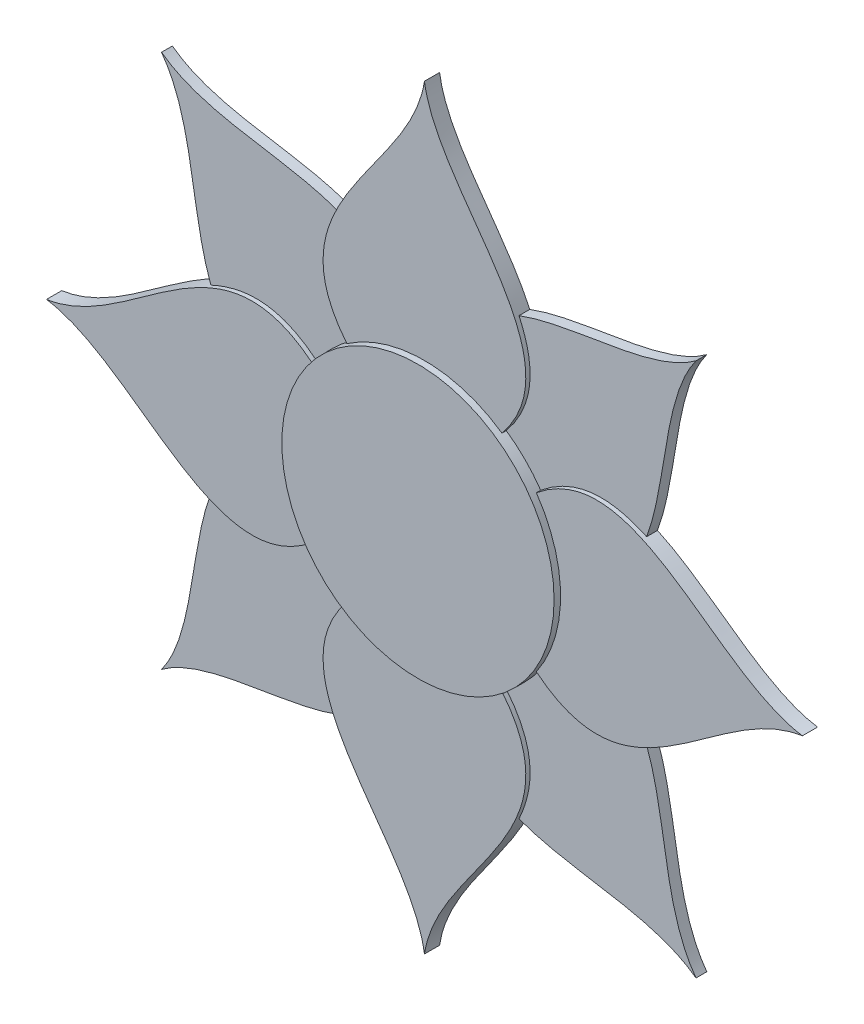
ISO-10303-21;
HEADER;
FILE_DESCRIPTION(('STEP AP214'),'2;1');
FILE_NAME('part.step','',(''),(''),'','','');
FILE_SCHEMA(('AUTOMOTIVE_DESIGN { 1 0 10303 214 1 1 1 1 }'));
ENDSEC;
DATA;
#1=APPLICATION_CONTEXT('core data for automotive mechanical design processes');
#2=APPLICATION_PROTOCOL_DEFINITION('international standard','automotive_design',2000,#1);
#3=PRODUCT_CONTEXT('',#1,'mechanical');
#4=PRODUCT('Part','Part','',(#3));
#5=PRODUCT_RELATED_PRODUCT_CATEGORY('part','',(#4));
#6=PRODUCT_DEFINITION_FORMATION('','',#4);
#7=PRODUCT_DEFINITION_CONTEXT('part definition',#1,'design');
#8=PRODUCT_DEFINITION('design','',#6,#7);
#9=PRODUCT_DEFINITION_SHAPE('','',#8);
#10=(LENGTH_UNIT() NAMED_UNIT(*) SI_UNIT(.MILLI.,.METRE.));
#11=(NAMED_UNIT(*) PLANE_ANGLE_UNIT() SI_UNIT($,.RADIAN.));
#12=(NAMED_UNIT(*) SI_UNIT($,.STERADIAN.) SOLID_ANGLE_UNIT());
#13=UNCERTAINTY_MEASURE_WITH_UNIT(LENGTH_MEASURE(1.E-05),#10,'distance_accuracy_value','');
#14=(GEOMETRIC_REPRESENTATION_CONTEXT(3) GLOBAL_UNCERTAINTY_ASSIGNED_CONTEXT((#13)) GLOBAL_UNIT_ASSIGNED_CONTEXT((#10,
#11,#12)) REPRESENTATION_CONTEXT('',''));
#15=CARTESIAN_POINT('',(0.,0.,0.));
#16=DIRECTION('',(0.,0.,1.));
#17=DIRECTION('',(1.,0.,0.));
#18=AXIS2_PLACEMENT_3D('',#15,#16,#17);
#19=CARTESIAN_POINT('',(-51.7912492608534,-35.8726678931079,7.));
#20=CARTESIAN_POINT('',(-96.7225206489418,-72.6487430730365,7.));
#21=CARTESIAN_POINT('',(-133.625302995382,-6.16642341126356,7.));
#22=CARTESIAN_POINT('',(-174.887829116811,1.83185277525639E-12,7.));
#23=B_SPLINE_CURVE_WITH_KNOTS('',3,(#19,#20,#21,#22),.UNSPECIFIED.,.F.,.F.,(4,4),(0.,1.),.UNSPECIFIED.);
#24=DIRECTION('',(0.,0.,-1.));
#25=VECTOR('',#24,1.);
#26=SURFACE_OF_LINEAR_EXTRUSION('',#23,#25);
#27=CARTESIAN_POINT('',(-51.7912492608534,-35.8726678931079,0.));
#28=CARTESIAN_POINT('',(-96.7225206489418,-72.6487430730365,0.));
#29=CARTESIAN_POINT('',(-133.625302995382,-6.16642341126356,0.));
#30=CARTESIAN_POINT('',(-174.887829116811,1.83185277525639E-12,0.));
#31=B_SPLINE_CURVE_WITH_KNOTS('',3,(#27,#28,#29,#30),.UNSPECIFIED.,.F.,.F.,(4,4),(0.,1.),.UNSPECIFIED.);
#32=CARTESIAN_POINT('',(-100.829128315532,-41.7647924305539,0.));
#33=VERTEX_POINT('',#32);
#34=CARTESIAN_POINT('',(-174.887829116811,1.83185277525639E-12,0.));
#35=VERTEX_POINT('',#34);
#36=EDGE_CURVE('E487',#33,#35,#31,.T.);
#37=ORIENTED_EDGE('',*,*,#36,.F.);
#38=DIRECTION('',(0.,0.,-1.));
#39=VECTOR('',#38,1.);
#40=CARTESIAN_POINT('',(-100.829128315532,-41.7647924305539,5.));
#41=LINE('',#40,#39);
#42=CARTESIAN_POINT('',(-100.829128315532,-41.7647924305539,5.));
#43=VERTEX_POINT('',#42);
#44=EDGE_CURVE('E90',#43,#33,#41,.T.);
#45=ORIENTED_EDGE('',*,*,#44,.F.);
#46=CARTESIAN_POINT('',(-51.7912492608534,-35.8726678931079,5.));
#47=CARTESIAN_POINT('',(-96.7225206489418,-72.6487430730365,5.));
#48=CARTESIAN_POINT('',(-133.625302995382,-6.16642341126356,5.));
#49=CARTESIAN_POINT('',(-174.887829116811,1.83185277525639E-12,5.));
#50=B_SPLINE_CURVE_WITH_KNOTS('',3,(#46,#47,#48,#49),.UNSPECIFIED.,.F.,.F.,(4,4),(0.,1.),.UNSPECIFIED.);
#51=CARTESIAN_POINT('',(-51.7912492608534,-35.8726678931079,5.));
#52=VERTEX_POINT('',#51);
#53=EDGE_CURVE('E94',#52,#43,#50,.T.);
#54=ORIENTED_EDGE('',*,*,#53,.F.);
#55=DIRECTION('',(0.,0.,-1.));
#56=VECTOR('',#55,1.);
#57=CARTESIAN_POINT('',(-51.7912492608534,-35.8726678931079,7.));
#58=LINE('',#57,#56);
#59=CARTESIAN_POINT('',(-51.7912492608534,-35.8726678931079,7.));
#60=VERTEX_POINT('',#59);
#61=EDGE_CURVE('E82',#60,#52,#58,.T.);
#62=ORIENTED_EDGE('',*,*,#61,.F.);
#63=CARTESIAN_POINT('',(-174.887829116811,1.83185277525639E-12,7.));
#64=VERTEX_POINT('',#63);
#65=EDGE_CURVE('E524',#60,#64,#23,.T.);
#66=ORIENTED_EDGE('',*,*,#65,.T.);
#67=DIRECTION('',(0.,0.,-1.));
#68=VECTOR('',#67,1.);
#69=CARTESIAN_POINT('',(-174.887829116811,1.83185277525639E-12,7.));
#70=LINE('',#69,#68);
#71=EDGE_CURVE('E470',#64,#35,#70,.T.);
#72=ORIENTED_EDGE('',*,*,#71,.T.);
#73=EDGE_LOOP('',(#37,#45,#54,#62,#66,#72));
#74=FACE_BOUND('',#73,.T.);
#75=ADVANCED_FACE('F71',(#74),#26,.T.);
#76=CARTESIAN_POINT('',(35.8726678931081,-51.7912492608532,7.));
#77=CARTESIAN_POINT('',(72.6487430730368,-96.7225206489416,7.));
#78=CARTESIAN_POINT('',(6.16642341126404,-133.625302995382,7.));
#79=CARTESIAN_POINT('',(-1.22123518350426E-12,-174.887829116811,7.));
#80=B_SPLINE_CURVE_WITH_KNOTS('',3,(#76,#77,#78,#79),.UNSPECIFIED.,.F.,.F.,(4,4),(0.,1.),.UNSPECIFIED.);
#81=DIRECTION('',(0.,0.,-1.));
#82=VECTOR('',#81,1.);
#83=SURFACE_OF_LINEAR_EXTRUSION('',#80,#82);
#84=CARTESIAN_POINT('',(35.8726678931081,-51.7912492608532,0.));
#85=CARTESIAN_POINT('',(72.6487430730368,-96.7225206489416,0.));
#86=CARTESIAN_POINT('',(6.16642341126404,-133.625302995382,0.));
#87=CARTESIAN_POINT('',(-1.22123518350426E-12,-174.887829116811,0.));
#88=B_SPLINE_CURVE_WITH_KNOTS('',3,(#84,#85,#86,#87),.UNSPECIFIED.,.F.,.F.,(4,4),(0.,1.),.UNSPECIFIED.);
#89=CARTESIAN_POINT('',(41.7647924305543,-100.829128315532,0.));
#90=VERTEX_POINT('',#89);
#91=CARTESIAN_POINT('',(-1.22123518350426E-12,-174.887829116811,0.));
#92=VERTEX_POINT('',#91);
#93=EDGE_CURVE('E582',#90,#92,#88,.T.);
#94=ORIENTED_EDGE('',*,*,#93,.F.);
#95=DIRECTION('',(0.,0.,-1.));
#96=VECTOR('',#95,1.);
#97=CARTESIAN_POINT('',(41.7647924305543,-100.829128315532,5.));
#98=LINE('',#97,#96);
#99=CARTESIAN_POINT('',(41.7647924305543,-100.829128315532,5.));
#100=VERTEX_POINT('',#99);
#101=EDGE_CURVE('E302',#100,#90,#98,.T.);
#102=ORIENTED_EDGE('',*,*,#101,.F.);
#103=CARTESIAN_POINT('',(35.8726678931081,-51.7912492608532,5.));
#104=CARTESIAN_POINT('',(72.6487430730368,-96.7225206489416,5.));
#105=CARTESIAN_POINT('',(6.16642341126404,-133.625302995382,5.));
#106=CARTESIAN_POINT('',(-1.22123518350426E-12,-174.887829116811,5.));
#107=B_SPLINE_CURVE_WITH_KNOTS('',3,(#103,#104,#105,#106),.UNSPECIFIED.,.F.,.F.,(4,4),(0.,1.),.UNSPECIFIED.);
#108=CARTESIAN_POINT('',(35.8726678931081,-51.7912492608532,5.));
#109=VERTEX_POINT('',#108);
#110=EDGE_CURVE('E616',#109,#100,#107,.T.);
#111=ORIENTED_EDGE('',*,*,#110,.F.);
#112=DIRECTION('',(0.,0.,-1.));
#113=VECTOR('',#112,1.);
#114=CARTESIAN_POINT('',(35.8726678931081,-51.7912492608532,7.));
#115=LINE('',#114,#113);
#116=CARTESIAN_POINT('',(35.8726678931081,-51.7912492608532,7.));
#117=VERTEX_POINT('',#116);
#118=EDGE_CURVE('E413',#117,#109,#115,.T.);
#119=ORIENTED_EDGE('',*,*,#118,.F.);
#120=CARTESIAN_POINT('',(-1.22123518350426E-12,-174.887829116811,7.));
#121=VERTEX_POINT('',#120);
#122=EDGE_CURVE('E353',#117,#121,#80,.T.);
#123=ORIENTED_EDGE('',*,*,#122,.T.);
#124=DIRECTION('',(0.,0.,-1.));
#125=VECTOR('',#124,1.);
#126=CARTESIAN_POINT('',(-1.22123518350426E-12,-174.887829116811,7.));
#127=LINE('',#126,#125);
#128=EDGE_CURVE('E607',#121,#92,#127,.T.);
#129=ORIENTED_EDGE('',*,*,#128,.T.);
#130=EDGE_LOOP('',(#94,#102,#111,#119,#123,#129));
#131=FACE_BOUND('',#130,.T.);
#132=ADVANCED_FACE('F366',(#131),#83,.T.);
#133=CARTESIAN_POINT('',(51.7912492608531,35.8726678931083,7.));
#134=CARTESIAN_POINT('',(96.7225206489414,72.6487430730372,7.));
#135=CARTESIAN_POINT('',(133.625302995382,6.16642341126452,7.));
#136=CARTESIAN_POINT('',(174.887829116811,-6.10617591752131E-13,7.));
#137=B_SPLINE_CURVE_WITH_KNOTS('',3,(#133,#134,#135,#136),.UNSPECIFIED.,.F.,.F.,(4,4),(0.,1.),.UNSPECIFIED.);
#138=DIRECTION('',(0.,0.,-1.));
#139=VECTOR('',#138,1.);
#140=SURFACE_OF_LINEAR_EXTRUSION('',#137,#139);
#141=CARTESIAN_POINT('',(51.7912492608531,35.8726678931083,0.));
#142=CARTESIAN_POINT('',(96.7225206489414,72.6487430730372,0.));
#143=CARTESIAN_POINT('',(133.625302995382,6.16642341126452,0.));
#144=CARTESIAN_POINT('',(174.887829116811,-6.10617591752131E-13,0.));
#145=B_SPLINE_CURVE_WITH_KNOTS('',3,(#141,#142,#143,#144),.UNSPECIFIED.,.F.,.F.,(4,4),(0.,1.),.UNSPECIFIED.);
#146=CARTESIAN_POINT('',(100.829128315532,41.7647924305546,0.));
#147=VERTEX_POINT('',#146);
#148=CARTESIAN_POINT('',(174.887829116811,-6.10617591752131E-13,0.));
#149=VERTEX_POINT('',#148);
#150=EDGE_CURVE('E408',#147,#149,#145,.T.);
#151=ORIENTED_EDGE('',*,*,#150,.F.);
#152=DIRECTION('',(0.,0.,-1.));
#153=VECTOR('',#152,1.);
#154=CARTESIAN_POINT('',(100.829128315532,41.7647924305546,5.));
#155=LINE('',#154,#153);
#156=CARTESIAN_POINT('',(100.829128315532,41.7647924305546,5.));
#157=VERTEX_POINT('',#156);
#158=EDGE_CURVE('E538',#157,#147,#155,.T.);
#159=ORIENTED_EDGE('',*,*,#158,.F.);
#160=CARTESIAN_POINT('',(51.7912492608531,35.8726678931083,5.));
#161=CARTESIAN_POINT('',(96.7225206489414,72.6487430730372,5.));
#162=CARTESIAN_POINT('',(133.625302995382,6.16642341126452,5.));
#163=CARTESIAN_POINT('',(174.887829116811,-6.10617591752131E-13,5.));
#164=B_SPLINE_CURVE_WITH_KNOTS('',3,(#160,#161,#162,#163),.UNSPECIFIED.,.F.,.F.,(4,4),(0.,1.),.UNSPECIFIED.);
#165=CARTESIAN_POINT('',(51.7912492608531,35.8726678931083,5.));
#166=VERTEX_POINT('',#165);
#167=EDGE_CURVE('E310',#166,#157,#164,.T.);
#168=ORIENTED_EDGE('',*,*,#167,.F.);
#169=DIRECTION('',(0.,0.,-1.));
#170=VECTOR('',#169,1.);
#171=CARTESIAN_POINT('',(51.7912492608531,35.8726678931083,7.));
#172=LINE('',#171,#170);
#173=CARTESIAN_POINT('',(51.7912492608531,35.8726678931083,7.));
#174=VERTEX_POINT('',#173);
#175=EDGE_CURVE('E418',#174,#166,#172,.T.);
#176=ORIENTED_EDGE('',*,*,#175,.F.);
#177=CARTESIAN_POINT('',(174.887829116811,-6.10617591752131E-13,7.));
#178=VERTEX_POINT('',#177);
#179=EDGE_CURVE('E664',#174,#178,#137,.T.);
#180=ORIENTED_EDGE('',*,*,#179,.T.);
#181=DIRECTION('',(0.,0.,-1.));
#182=VECTOR('',#181,1.);
#183=CARTESIAN_POINT('',(174.887829116811,-6.10617591752131E-13,7.));
#184=LINE('',#183,#182);
#185=EDGE_CURVE('E391',#178,#149,#184,.T.);
#186=ORIENTED_EDGE('',*,*,#185,.T.);
#187=EDGE_LOOP('',(#151,#159,#168,#176,#180,#186));
#188=FACE_BOUND('',#187,.T.);
#189=ADVANCED_FACE('F370',(#188),#140,.T.);
#190=CARTESIAN_POINT('',(-35.8726678931085,51.791249260853,7.));
#191=CARTESIAN_POINT('',(-72.6487430730375,96.7225206489411,7.));
#192=CARTESIAN_POINT('',(-6.16642341126502,133.625302995382,7.));
#193=CARTESIAN_POINT('',(0.,174.887829116811,7.));
#194=B_SPLINE_CURVE_WITH_KNOTS('',3,(#190,#191,#192,#193),.UNSPECIFIED.,.F.,.F.,(4,4),(0.,1.),.UNSPECIFIED.);
#195=DIRECTION('',(0.,0.,-1.));
#196=VECTOR('',#195,1.);
#197=SURFACE_OF_LINEAR_EXTRUSION('',#194,#196);
#198=CARTESIAN_POINT('',(-35.8726678931085,51.791249260853,0.));
#199=CARTESIAN_POINT('',(-72.6487430730375,96.7225206489411,0.));
#200=CARTESIAN_POINT('',(-6.16642341126502,133.625302995382,0.));
#201=CARTESIAN_POINT('',(0.,174.887829116811,0.));
#202=B_SPLINE_CURVE_WITH_KNOTS('',3,(#198,#199,#200,#201),.UNSPECIFIED.,.F.,.F.,(4,4),(0.,1.),.UNSPECIFIED.);
#203=CARTESIAN_POINT('',(-41.7647924305546,100.829128315533,0.));
#204=VERTEX_POINT('',#203);
#205=CARTESIAN_POINT('',(0.,174.887829116811,0.));
#206=VERTEX_POINT('',#205);
#207=EDGE_CURVE('E433',#204,#206,#202,.T.);
#208=ORIENTED_EDGE('',*,*,#207,.F.);
#209=DIRECTION('',(0.,0.,-1.));
#210=VECTOR('',#209,1.);
#211=CARTESIAN_POINT('',(-41.7647924305546,100.829128315533,5.));
#212=LINE('',#211,#210);
#213=CARTESIAN_POINT('',(-41.7647924305546,100.829128315533,5.));
#214=VERTEX_POINT('',#213);
#215=EDGE_CURVE('E352',#214,#204,#212,.T.);
#216=ORIENTED_EDGE('',*,*,#215,.F.);
#217=CARTESIAN_POINT('',(-35.8726678931085,51.791249260853,5.));
#218=CARTESIAN_POINT('',(-72.6487430730375,96.7225206489411,5.));
#219=CARTESIAN_POINT('',(-6.16642341126502,133.625302995382,5.));
#220=CARTESIAN_POINT('',(0.,174.887829116811,5.));
#221=B_SPLINE_CURVE_WITH_KNOTS('',3,(#217,#218,#219,#220),.UNSPECIFIED.,.F.,.F.,(4,4),(0.,1.),.UNSPECIFIED.);
#222=CARTESIAN_POINT('',(-35.8726678931085,51.791249260853,5.));
#223=VERTEX_POINT('',#222);
#224=EDGE_CURVE('E343',#223,#214,#221,.T.);
#225=ORIENTED_EDGE('',*,*,#224,.F.);
#226=DIRECTION('',(0.,0.,-1.));
#227=VECTOR('',#226,1.);
#228=CARTESIAN_POINT('',(-35.8726678931085,51.791249260853,7.));
#229=LINE('',#228,#227);
#230=CARTESIAN_POINT('',(-35.8726678931085,51.791249260853,7.));
#231=VERTEX_POINT('',#230);
#232=EDGE_CURVE('E506',#231,#223,#229,.T.);
#233=ORIENTED_EDGE('',*,*,#232,.F.);
#234=CARTESIAN_POINT('',(0.,174.887829116811,7.));
#235=VERTEX_POINT('',#234);
#236=EDGE_CURVE('E438',#231,#235,#194,.T.);
#237=ORIENTED_EDGE('',*,*,#236,.T.);
#238=DIRECTION('',(0.,0.,-1.));
#239=VECTOR('',#238,1.);
#240=CARTESIAN_POINT('',(0.,174.887829116811,7.));
#241=LINE('',#240,#239);
#242=EDGE_CURVE('E520',#235,#206,#241,.T.);
#243=ORIENTED_EDGE('',*,*,#242,.T.);
#244=EDGE_LOOP('',(#208,#216,#225,#233,#237,#243));
#245=FACE_BOUND('',#244,.T.);
#246=ADVANCED_FACE('F452',(#245),#197,.T.);
#247=CARTESIAN_POINT('',(0.,0.,10.));
#248=DIRECTION('',(0.,0.,-1.));
#249=DIRECTION('',(-1.,0.,0.));
#250=AXIS2_PLACEMENT_3D('',#247,#248,#249);
#251=CYLINDRICAL_SURFACE('',#250,63.0014428546606);
#252=ORIENTED_EDGE('',*,*,#61,.T.);
#253=CARTESIAN_POINT('',(0.,0.,5.));
#254=DIRECTION('',(0.,0.,1.));
#255=DIRECTION('',(1.,0.,0.));
#256=AXIS2_PLACEMENT_3D('',#253,#254,#255);
#257=CIRCLE('',#256,63.0014428546606);
#258=CARTESIAN_POINT('',(-35.8726678931088,-51.7912492608527,5.));
#259=VERTEX_POINT('',#258);
#260=EDGE_CURVE('E763',#52,#259,#257,.T.);
#261=ORIENTED_EDGE('',*,*,#260,.T.);
#262=DIRECTION('',(0.,0.,-1.));
#263=VECTOR('',#262,1.);
#264=CARTESIAN_POINT('',(-35.8726678931088,-51.7912492608527,7.));
#265=LINE('',#264,#263);
#266=CARTESIAN_POINT('',(-35.8726678931088,-51.7912492608527,7.));
#267=VERTEX_POINT('',#266);
#268=EDGE_CURVE('E492',#267,#259,#265,.T.);
#269=ORIENTED_EDGE('',*,*,#268,.F.);
#270=CARTESIAN_POINT('',(0.,0.,7.));
#271=DIRECTION('',(0.,0.,1.));
#272=DIRECTION('',(1.,0.,0.));
#273=AXIS2_PLACEMENT_3D('',#270,#271,#272);
#274=CIRCLE('',#273,63.0014428546606);
#275=EDGE_CURVE('E359',#267,#117,#274,.T.);
#276=ORIENTED_EDGE('',*,*,#275,.T.);
#277=ORIENTED_EDGE('',*,*,#118,.T.);
#278=CARTESIAN_POINT('',(0.,0.,5.));
#279=DIRECTION('',(0.,0.,1.));
#280=DIRECTION('',(1.,0.,0.));
#281=AXIS2_PLACEMENT_3D('',#278,#279,#280);
#282=CIRCLE('',#281,63.0014428546606);
#283=CARTESIAN_POINT('',(51.7912492608529,-35.8726678931086,5.));
#284=VERTEX_POINT('',#283);
#285=EDGE_CURVE('E621',#109,#284,#282,.T.);
#286=ORIENTED_EDGE('',*,*,#285,.T.);
#287=DIRECTION('',(0.,0.,-1.));
#288=VECTOR('',#287,1.);
#289=CARTESIAN_POINT('',(51.7912492608529,-35.8726678931086,7.));
#290=LINE('',#289,#288);
#291=CARTESIAN_POINT('',(51.7912492608529,-35.8726678931086,7.));
#292=VERTEX_POINT('',#291);
#293=EDGE_CURVE('E423',#292,#284,#290,.T.);
#294=ORIENTED_EDGE('',*,*,#293,.F.);
#295=CARTESIAN_POINT('',(0.,0.,7.));
#296=DIRECTION('',(0.,0.,1.));
#297=DIRECTION('',(1.,0.,0.));
#298=AXIS2_PLACEMENT_3D('',#295,#296,#297);
#299=CIRCLE('',#298,63.0014428546606);
#300=EDGE_CURVE('E392',#292,#174,#299,.T.);
#301=ORIENTED_EDGE('',*,*,#300,.T.);
#302=ORIENTED_EDGE('',*,*,#175,.T.);
#303=CARTESIAN_POINT('',(0.,0.,5.));
#304=DIRECTION('',(0.,0.,1.));
#305=DIRECTION('',(1.,0.,0.));
#306=AXIS2_PLACEMENT_3D('',#303,#304,#305);
#307=CIRCLE('',#306,63.0014428546606);
#308=CARTESIAN_POINT('',(35.8726678931085,51.791249260853,5.));
#309=VERTEX_POINT('',#308);
#310=EDGE_CURVE('E556',#166,#309,#307,.T.);
#311=ORIENTED_EDGE('',*,*,#310,.T.);
#312=DIRECTION('',(0.,0.,-1.));
#313=VECTOR('',#312,1.);
#314=CARTESIAN_POINT('',(35.8726678931085,51.791249260853,7.));
#315=LINE('',#314,#313);
#316=CARTESIAN_POINT('',(35.8726678931085,51.791249260853,7.));
#317=VERTEX_POINT('',#316);
#318=EDGE_CURVE('E491',#317,#309,#315,.T.);
#319=ORIENTED_EDGE('',*,*,#318,.F.);
#320=CARTESIAN_POINT('',(0.,0.,7.));
#321=DIRECTION('',(0.,0.,1.));
#322=DIRECTION('',(1.,0.,0.));
#323=AXIS2_PLACEMENT_3D('',#320,#321,#322);
#324=CIRCLE('',#323,63.0014428546606);
#325=EDGE_CURVE('E430',#317,#231,#324,.T.);
#326=ORIENTED_EDGE('',*,*,#325,.T.);
#327=ORIENTED_EDGE('',*,*,#232,.T.);
#328=CARTESIAN_POINT('',(0.,0.,5.));
#329=DIRECTION('',(0.,0.,1.));
#330=DIRECTION('',(1.,0.,0.));
#331=AXIS2_PLACEMENT_3D('',#328,#329,#330);
#332=CIRCLE('',#331,63.0014428546606);
#333=CARTESIAN_POINT('',(-51.7912492608526,35.872667893109,5.));
#334=VERTEX_POINT('',#333);
#335=EDGE_CURVE('E710',#223,#334,#332,.T.);
#336=ORIENTED_EDGE('',*,*,#335,.T.);
#337=DIRECTION('',(0.,0.,-1.));
#338=VECTOR('',#337,1.);
#339=CARTESIAN_POINT('',(-51.7912492608526,35.872667893109,7.));
#340=LINE('',#339,#338);
#341=CARTESIAN_POINT('',(-51.7912492608526,35.872667893109,7.));
#342=VERTEX_POINT('',#341);
#343=EDGE_CURVE('E497',#342,#334,#340,.T.);
#344=ORIENTED_EDGE('',*,*,#343,.F.);
#345=CARTESIAN_POINT('',(0.,0.,7.));
#346=DIRECTION('',(0.,0.,1.));
#347=DIRECTION('',(1.,0.,0.));
#348=AXIS2_PLACEMENT_3D('',#345,#346,#347);
#349=CIRCLE('',#348,63.0014428546606);
#350=EDGE_CURVE('E471',#342,#60,#349,.T.);
#351=ORIENTED_EDGE('',*,*,#350,.T.);
#352=EDGE_LOOP('',(#252,#261,#269,#276,#277,#286,#294,#301,#302,#311,#319,#326,#327,#336,#344,#351));
#353=FACE_BOUND('',#352,.T.);
#354=CARTESIAN_POINT('',(0.,0.,10.));
#355=DIRECTION('',(0.,0.,1.));
#356=DIRECTION('',(1.,0.,0.));
#357=AXIS2_PLACEMENT_3D('',#354,#355,#356);
#358=CIRCLE('',#357,63.0014428546606);
#359=CARTESIAN_POINT('',(63.0014428546606,0.,10.));
#360=VERTEX_POINT('',#359);
#361=EDGE_CURVE('E12',#360,#360,#358,.T.);
#362=ORIENTED_EDGE('',*,*,#361,.F.);
#363=EDGE_LOOP('',(#362));
#364=FACE_BOUND('',#363,.T.);
#365=ADVANCED_FACE('F73',(#353,#364),#251,.T.);
#366=CARTESIAN_POINT('',(0.,0.,10.));
#367=DIRECTION('',(0.,0.,1.));
#368=DIRECTION('',(1.,0.,0.));
#369=AXIS2_PLACEMENT_3D('',#366,#367,#368);
#370=PLANE('',#369);
#371=ORIENTED_EDGE('',*,*,#361,.T.);
#372=EDGE_LOOP('',(#371));
#373=FACE_BOUND('',#372,.T.);
#374=ADVANCED_FACE('F828',(#373),#370,.T.);
#375=CARTESIAN_POINT('',(0.,0.,0.));
#376=DIRECTION('',(0.,0.,1.));
#377=DIRECTION('',(1.,0.,0.));
#378=AXIS2_PLACEMENT_3D('',#375,#376,#377);
#379=PLANE('',#378);
#380=CARTESIAN_POINT('',(-100.829128315532,-41.7647924305539,0.));
#381=CARTESIAN_POINT('',(-110.436752916225,-67.4533414675382,0.));
#382=CARTESIAN_POINT('',(-108.403199610627,-103.040391174272,0.));
#383=CARTESIAN_POINT('',(-123.664369915492,-123.66436991549,0.));
#384=B_SPLINE_CURVE_WITH_KNOTS('',3,(#380,#381,#382,#383),.UNSPECIFIED.,.F.,.F.,(4,4),
(0.385044140049978,1.),.UNSPECIFIED.);
#385=CARTESIAN_POINT('',(-123.664369915492,-123.66436991549,0.));
#386=VERTEX_POINT('',#385);
#387=EDGE_CURVE('E248',#33,#386,#384,.T.);
#388=ORIENTED_EDGE('',*,*,#387,.F.);
#389=ORIENTED_EDGE('',*,*,#36,.T.);
#390=CARTESIAN_POINT('',(-51.7912492608526,35.872667893109,0.));
#391=CARTESIAN_POINT('',(-96.7225206489403,72.6487430730385,0.));
#392=CARTESIAN_POINT('',(-133.625302995382,6.16642341126636,0.));
#393=CARTESIAN_POINT('',(-174.887829116811,1.83185277525639E-12,0.));
#394=B_SPLINE_CURVE_WITH_KNOTS('',3,(#390,#391,#392,#393),.UNSPECIFIED.,.F.,.F.,(4,4),(0.,1.),.UNSPECIFIED.);
#395=CARTESIAN_POINT('',(-100.829128315532,41.764792430556,0.));
#396=VERTEX_POINT('',#395);
#397=EDGE_CURVE('E490',#396,#35,#394,.T.);
#398=ORIENTED_EDGE('',*,*,#397,.F.);
#399=CARTESIAN_POINT('',(-100.829128315532,41.764792430556,0.));
#400=CARTESIAN_POINT('',(-110.436752916224,67.4533414675405,0.));
#401=CARTESIAN_POINT('',(-108.403199610625,103.040391174274,0.));
#402=CARTESIAN_POINT('',(-123.664369915489,123.664369915492,0.));
#403=B_SPLINE_CURVE_WITH_KNOTS('',3,(#399,#400,#401,#402),.UNSPECIFIED.,.F.,.F.,(4,4),
(0.385044140049978,1.),.UNSPECIFIED.);
#404=CARTESIAN_POINT('',(-123.664369915489,123.664369915492,0.));
#405=VERTEX_POINT('',#404);
#406=EDGE_CURVE('E544',#396,#405,#403,.T.);
#407=ORIENTED_EDGE('',*,*,#406,.T.);
#408=CARTESIAN_POINT('',(-41.7647924305546,100.829128315533,0.));
#409=CARTESIAN_POINT('',(-67.4533414675387,110.436752916225,0.));
#410=CARTESIAN_POINT('',(-103.040391174272,108.403199610628,0.));
#411=CARTESIAN_POINT('',(-123.664369915489,123.664369915492,0.));
#412=B_SPLINE_CURVE_WITH_KNOTS('',3,(#408,#409,#410,#411),.UNSPECIFIED.,.F.,.F.,(4,4),
(0.385044140049986,1.),.UNSPECIFIED.);
#413=EDGE_CURVE('E734',#204,#405,#412,.T.);
#414=ORIENTED_EDGE('',*,*,#413,.F.);
#415=ORIENTED_EDGE('',*,*,#207,.T.);
#416=CARTESIAN_POINT('',(35.8726678931085,51.791249260853,0.));
#417=CARTESIAN_POINT('',(72.6487430730375,96.7225206489411,0.));
#418=CARTESIAN_POINT('',(6.16642341126502,133.625302995382,0.));
#419=CARTESIAN_POINT('',(0.,174.887829116811,0.));
#420=B_SPLINE_CURVE_WITH_KNOTS('',3,(#416,#417,#418,#419),.UNSPECIFIED.,.F.,.F.,(4,4),(0.,1.),.UNSPECIFIED.);
#421=CARTESIAN_POINT('',(41.764792430555,100.829128315532,0.));
#422=VERTEX_POINT('',#421);
#423=EDGE_CURVE('E422',#422,#206,#420,.T.);
#424=ORIENTED_EDGE('',*,*,#423,.F.);
#425=CARTESIAN_POINT('',(41.764792430555,100.829128315532,0.));
#426=CARTESIAN_POINT('',(67.4533414675394,110.436752916224,0.));
#427=CARTESIAN_POINT('',(103.040391174273,108.403199610626,0.));
#428=CARTESIAN_POINT('',(123.664369915491,123.664369915491,0.));
#429=B_SPLINE_CURVE_WITH_KNOTS('',3,(#425,#426,#427,#428),.UNSPECIFIED.,.F.,.F.,(4,4),
(0.385044140049979,1.),.UNSPECIFIED.);
#430=CARTESIAN_POINT('',(123.664369915491,123.664369915491,0.));
#431=VERTEX_POINT('',#430);
#432=EDGE_CURVE('E533',#422,#431,#429,.T.);
#433=ORIENTED_EDGE('',*,*,#432,.T.);
#434=CARTESIAN_POINT('',(100.829128315532,41.7647924305546,0.));
#435=CARTESIAN_POINT('',(110.436752916225,67.4533414675389,0.));
#436=CARTESIAN_POINT('',(108.403199610627,103.040391174273,0.));
#437=CARTESIAN_POINT('',(123.664369915491,123.664369915491,0.));
#438=B_SPLINE_CURVE_WITH_KNOTS('',3,(#434,#435,#436,#437),.UNSPECIFIED.,.F.,.F.,(4,4),
(0.385044140049978,1.),.UNSPECIFIED.);
#439=EDGE_CURVE('E530',#147,#431,#438,.T.);
#440=ORIENTED_EDGE('',*,*,#439,.F.);
#441=ORIENTED_EDGE('',*,*,#150,.T.);
#442=CARTESIAN_POINT('',(51.7912492608529,-35.8726678931086,0.));
#443=CARTESIAN_POINT('',(96.7225206489409,-72.6487430730378,0.));
#444=CARTESIAN_POINT('',(133.625302995382,-6.16642341126543,0.));
#445=CARTESIAN_POINT('',(174.887829116811,-6.10617591752131E-13,0.));
#446=B_SPLINE_CURVE_WITH_KNOTS('',3,(#442,#443,#444,#445),.UNSPECIFIED.,.F.,.F.,(4,4),(0.,1.),.UNSPECIFIED.);
#447=CARTESIAN_POINT('',(100.829128315532,-41.7647924305554,0.));
#448=VERTEX_POINT('',#447);
#449=EDGE_CURVE('E412',#448,#149,#446,.T.);
#450=ORIENTED_EDGE('',*,*,#449,.F.);
#451=CARTESIAN_POINT('',(100.829128315532,-41.7647924305553,0.));
#452=CARTESIAN_POINT('',(110.436752916224,-67.4533414675397,0.));
#453=CARTESIAN_POINT('',(108.403199610626,-103.040391174273,0.));
#454=CARTESIAN_POINT('',(123.66436991549,-123.664369915492,0.));
#455=B_SPLINE_CURVE_WITH_KNOTS('',3,(#451,#452,#453,#454),.UNSPECIFIED.,.F.,.F.,(4,4),
(0.385044140049979,1.),.UNSPECIFIED.);
#456=CARTESIAN_POINT('',(123.66436991549,-123.664369915492,0.));
#457=VERTEX_POINT('',#456);
#458=EDGE_CURVE('E635',#448,#457,#455,.T.);
#459=ORIENTED_EDGE('',*,*,#458,.T.);
#460=CARTESIAN_POINT('',(41.7647924305543,-100.829128315532,0.));
#461=CARTESIAN_POINT('',(67.4533414675386,-110.436752916225,0.));
#462=CARTESIAN_POINT('',(103.040391174272,-108.403199610627,0.));
#463=CARTESIAN_POINT('',(123.66436991549,-123.664369915492,0.));
#464=B_SPLINE_CURVE_WITH_KNOTS('',3,(#460,#461,#462,#463),.UNSPECIFIED.,.F.,.F.,(4,4),
(0.385044140049978,1.),.UNSPECIFIED.);
#465=EDGE_CURVE('E645',#90,#457,#464,.T.);
#466=ORIENTED_EDGE('',*,*,#465,.F.);
#467=ORIENTED_EDGE('',*,*,#93,.T.);
#468=CARTESIAN_POINT('',(-35.8726678931088,-51.7912492608527,0.));
#469=CARTESIAN_POINT('',(-72.6487430730382,-96.7225206489406,0.));
#470=CARTESIAN_POINT('',(-6.16642341126591,-133.625302995382,0.));
#471=CARTESIAN_POINT('',(-1.22123518350426E-12,-174.887829116811,0.));
#472=B_SPLINE_CURVE_WITH_KNOTS('',3,(#468,#469,#470,#471),.UNSPECIFIED.,.F.,.F.,(4,4),(0.,1.),.UNSPECIFIED.);
#473=CARTESIAN_POINT('',(-41.7647924305557,-100.829128315532,0.));
#474=VERTEX_POINT('',#473);
#475=EDGE_CURVE('E360',#474,#92,#472,.T.);
#476=ORIENTED_EDGE('',*,*,#475,.F.);
#477=CARTESIAN_POINT('',(-41.7647924305557,-100.829128315532,0.));
#478=CARTESIAN_POINT('',(-67.4533414675401,-110.436752916224,0.));
#479=CARTESIAN_POINT('',(-103.040391174274,-108.403199610626,0.));
#480=CARTESIAN_POINT('',(-123.664369915492,-123.66436991549,0.));
#481=B_SPLINE_CURVE_WITH_KNOTS('',3,(#477,#478,#479,#480),.UNSPECIFIED.,.F.,.F.,(4,4),
(0.385044140049979,1.),.UNSPECIFIED.);
#482=EDGE_CURVE('E761',#474,#386,#481,.T.);
#483=ORIENTED_EDGE('',*,*,#482,.T.);
#484=EDGE_LOOP('',(#388,#389,#398,#407,#414,#415,#424,#433,#440,#441,#450,#459,#466,#467,#476,#483));
#485=FACE_BOUND('',#484,.T.);
#486=ADVANCED_FACE('F460',(#485),#379,.F.);
#487=CARTESIAN_POINT('',(-51.7912492608526,35.872667893109,7.));
#488=CARTESIAN_POINT('',(-96.7225206489403,72.6487430730385,7.));
#489=CARTESIAN_POINT('',(-133.625302995382,6.16642341126636,7.));
#490=CARTESIAN_POINT('',(-174.887829116811,1.83185277525639E-12,7.));
#491=B_SPLINE_CURVE_WITH_KNOTS('',3,(#487,#488,#489,#490),.UNSPECIFIED.,.F.,.F.,(4,4),(0.,1.),.UNSPECIFIED.);
#492=DIRECTION('',(0.,0.,-1.));
#493=VECTOR('',#492,1.);
#494=SURFACE_OF_LINEAR_EXTRUSION('',#491,#493);
#495=CARTESIAN_POINT('',(-51.7912492608526,35.872667893109,5.));
#496=CARTESIAN_POINT('',(-96.7225206489403,72.6487430730385,5.));
#497=CARTESIAN_POINT('',(-133.625302995382,6.16642341126636,5.));
#498=CARTESIAN_POINT('',(-174.887829116811,1.83185277525639E-12,5.));
#499=B_SPLINE_CURVE_WITH_KNOTS('',3,(#495,#496,#497,#498),.UNSPECIFIED.,.F.,.F.,(4,4),(0.,1.),.UNSPECIFIED.);
#500=CARTESIAN_POINT('',(-100.829128315532,41.764792430556,5.));
#501=VERTEX_POINT('',#500);
#502=EDGE_CURVE('E711',#334,#501,#499,.T.);
#503=ORIENTED_EDGE('',*,*,#502,.T.);
#504=DIRECTION('',(0.,0.,-1.));
#505=VECTOR('',#504,1.);
#506=CARTESIAN_POINT('',(-100.829128315532,41.764792430556,5.));
#507=LINE('',#506,#505);
#508=EDGE_CURVE('E589',#501,#396,#507,.T.);
#509=ORIENTED_EDGE('',*,*,#508,.T.);
#510=ORIENTED_EDGE('',*,*,#397,.T.);
#511=ORIENTED_EDGE('',*,*,#71,.F.);
#512=EDGE_CURVE('E464',#342,#64,#491,.T.);
#513=ORIENTED_EDGE('',*,*,#512,.F.);
#514=ORIENTED_EDGE('',*,*,#343,.T.);
#515=EDGE_LOOP('',(#503,#509,#510,#511,#513,#514));
#516=FACE_BOUND('',#515,.T.);
#517=ADVANCED_FACE('F455',(#516),#494,.F.);
#518=CARTESIAN_POINT('',(0.,0.,7.));
#519=DIRECTION('',(0.,0.,1.));
#520=DIRECTION('',(1.,0.,0.));
#521=AXIS2_PLACEMENT_3D('',#518,#519,#520);
#522=PLANE('',#521);
#523=ORIENTED_EDGE('',*,*,#65,.F.);
#524=ORIENTED_EDGE('',*,*,#350,.F.);
#525=ORIENTED_EDGE('',*,*,#512,.T.);
#526=EDGE_LOOP('',(#523,#524,#525));
#527=FACE_BOUND('',#526,.T.);
#528=ADVANCED_FACE('F450',(#527),#522,.T.);
#529=CARTESIAN_POINT('',(35.8726678931085,51.791249260853,7.));
#530=CARTESIAN_POINT('',(72.6487430730375,96.7225206489411,7.));
#531=CARTESIAN_POINT('',(6.16642341126502,133.625302995382,7.));
#532=CARTESIAN_POINT('',(0.,174.887829116811,7.));
#533=B_SPLINE_CURVE_WITH_KNOTS('',3,(#529,#530,#531,#532),.UNSPECIFIED.,.F.,.F.,(4,4),(0.,1.),.UNSPECIFIED.);
#534=DIRECTION('',(0.,0.,-1.));
#535=VECTOR('',#534,1.);
#536=SURFACE_OF_LINEAR_EXTRUSION('',#533,#535);
#537=CARTESIAN_POINT('',(35.8726678931085,51.791249260853,5.));
#538=CARTESIAN_POINT('',(72.6487430730375,96.7225206489411,5.));
#539=CARTESIAN_POINT('',(6.16642341126502,133.625302995382,5.));
#540=CARTESIAN_POINT('',(0.,174.887829116811,5.));
#541=B_SPLINE_CURVE_WITH_KNOTS('',3,(#537,#538,#539,#540),.UNSPECIFIED.,.F.,.F.,(4,4),(0.,1.),.UNSPECIFIED.);
#542=CARTESIAN_POINT('',(41.764792430555,100.829128315532,5.));
#543=VERTEX_POINT('',#542);
#544=EDGE_CURVE('E551',#309,#543,#541,.T.);
#545=ORIENTED_EDGE('',*,*,#544,.T.);
#546=DIRECTION('',(0.,0.,-1.));
#547=VECTOR('',#546,1.);
#548=CARTESIAN_POINT('',(41.764792430555,100.829128315532,5.));
#549=LINE('',#548,#547);
#550=EDGE_CURVE('E548',#543,#422,#549,.T.);
#551=ORIENTED_EDGE('',*,*,#550,.T.);
#552=ORIENTED_EDGE('',*,*,#423,.T.);
#553=ORIENTED_EDGE('',*,*,#242,.F.);
#554=EDGE_CURVE('E432',#317,#235,#533,.T.);
#555=ORIENTED_EDGE('',*,*,#554,.F.);
#556=ORIENTED_EDGE('',*,*,#318,.T.);
#557=EDGE_LOOP('',(#545,#551,#552,#553,#555,#556));
#558=FACE_BOUND('',#557,.T.);
#559=ADVANCED_FACE('F446',(#558),#536,.F.);
#560=CARTESIAN_POINT('',(0.,0.,7.));
#561=DIRECTION('',(0.,0.,1.));
#562=DIRECTION('',(1.,0.,0.));
#563=AXIS2_PLACEMENT_3D('',#560,#561,#562);
#564=PLANE('',#563);
#565=ORIENTED_EDGE('',*,*,#325,.F.);
#566=ORIENTED_EDGE('',*,*,#554,.T.);
#567=ORIENTED_EDGE('',*,*,#236,.F.);
#568=EDGE_LOOP('',(#565,#566,#567));
#569=FACE_BOUND('',#568,.T.);
#570=ADVANCED_FACE('F381',(#569),#564,.T.);
#571=CARTESIAN_POINT('',(51.7912492608529,-35.8726678931086,7.));
#572=CARTESIAN_POINT('',(96.7225206489409,-72.6487430730378,7.));
#573=CARTESIAN_POINT('',(133.625302995382,-6.16642341126543,7.));
#574=CARTESIAN_POINT('',(174.887829116811,-6.10617591752131E-13,7.));
#575=B_SPLINE_CURVE_WITH_KNOTS('',3,(#571,#572,#573,#574),.UNSPECIFIED.,.F.,.F.,(4,4),(0.,1.),.UNSPECIFIED.);
#576=DIRECTION('',(0.,0.,-1.));
#577=VECTOR('',#576,1.);
#578=SURFACE_OF_LINEAR_EXTRUSION('',#575,#577);
#579=CARTESIAN_POINT('',(51.7912492608529,-35.8726678931086,5.));
#580=CARTESIAN_POINT('',(96.7225206489409,-72.6487430730378,5.));
#581=CARTESIAN_POINT('',(133.625302995382,-6.16642341126543,5.));
#582=CARTESIAN_POINT('',(174.887829116811,-6.10617591752131E-13,5.));
#583=B_SPLINE_CURVE_WITH_KNOTS('',3,(#579,#580,#581,#582),.UNSPECIFIED.,.F.,.F.,(4,4),(0.,1.),.UNSPECIFIED.);
#584=CARTESIAN_POINT('',(100.829128315532,-41.7647924305554,5.));
#585=VERTEX_POINT('',#584);
#586=EDGE_CURVE('E292',#284,#585,#583,.T.);
#587=ORIENTED_EDGE('',*,*,#586,.T.);
#588=DIRECTION('',(0.,0.,-1.));
#589=VECTOR('',#588,1.);
#590=CARTESIAN_POINT('',(100.829128315532,-41.7647924305554,5.));
#591=LINE('',#590,#589);
#592=EDGE_CURVE('E303',#585,#448,#591,.T.);
#593=ORIENTED_EDGE('',*,*,#592,.T.);
#594=ORIENTED_EDGE('',*,*,#449,.T.);
#595=ORIENTED_EDGE('',*,*,#185,.F.);
#596=EDGE_CURVE('E385',#292,#178,#575,.T.);
#597=ORIENTED_EDGE('',*,*,#596,.F.);
#598=ORIENTED_EDGE('',*,*,#293,.T.);
#599=EDGE_LOOP('',(#587,#593,#594,#595,#597,#598));
#600=FACE_BOUND('',#599,.T.);
#601=ADVANCED_FACE('F376',(#600),#578,.F.);
#602=CARTESIAN_POINT('',(0.,0.,7.));
#603=DIRECTION('',(0.,0.,1.));
#604=DIRECTION('',(1.,0.,0.));
#605=AXIS2_PLACEMENT_3D('',#602,#603,#604);
#606=PLANE('',#605);
#607=ORIENTED_EDGE('',*,*,#179,.F.);
#608=ORIENTED_EDGE('',*,*,#300,.F.);
#609=ORIENTED_EDGE('',*,*,#596,.T.);
#610=EDGE_LOOP('',(#607,#608,#609));
#611=FACE_BOUND('',#610,.T.);
#612=ADVANCED_FACE('F373',(#611),#606,.T.);
#613=CARTESIAN_POINT('',(-35.8726678931088,-51.7912492608527,7.));
#614=CARTESIAN_POINT('',(-72.6487430730382,-96.7225206489406,7.));
#615=CARTESIAN_POINT('',(-6.16642341126591,-133.625302995382,7.));
#616=CARTESIAN_POINT('',(-1.22123518350426E-12,-174.887829116811,7.));
#617=B_SPLINE_CURVE_WITH_KNOTS('',3,(#613,#614,#615,#616),.UNSPECIFIED.,.F.,.F.,(4,4),(0.,1.),.UNSPECIFIED.);
#618=DIRECTION('',(0.,0.,-1.));
#619=VECTOR('',#618,1.);
#620=SURFACE_OF_LINEAR_EXTRUSION('',#617,#619);
#621=CARTESIAN_POINT('',(-35.8726678931088,-51.7912492608527,5.));
#622=CARTESIAN_POINT('',(-72.6487430730382,-96.7225206489406,5.));
#623=CARTESIAN_POINT('',(-6.16642341126591,-133.625302995382,5.));
#624=CARTESIAN_POINT('',(-1.22123518350426E-12,-174.887829116811,5.));
#625=B_SPLINE_CURVE_WITH_KNOTS('',3,(#621,#622,#623,#624),.UNSPECIFIED.,.F.,.F.,(4,4),(0.,1.),.UNSPECIFIED.);
#626=CARTESIAN_POINT('',(-41.7647924305558,-100.829128315531,5.));
#627=VERTEX_POINT('',#626);
#628=EDGE_CURVE('E257',#259,#627,#625,.T.);
#629=ORIENTED_EDGE('',*,*,#628,.T.);
#630=DIRECTION('',(0.,0.,-1.));
#631=VECTOR('',#630,1.);
#632=CARTESIAN_POINT('',(-41.7647924305557,-100.829128315532,5.));
#633=LINE('',#632,#631);
#634=EDGE_CURVE('E252',#627,#474,#633,.T.);
#635=ORIENTED_EDGE('',*,*,#634,.T.);
#636=ORIENTED_EDGE('',*,*,#475,.T.);
#637=ORIENTED_EDGE('',*,*,#128,.F.);
#638=EDGE_CURVE('E596',#267,#121,#617,.T.);
#639=ORIENTED_EDGE('',*,*,#638,.F.);
#640=ORIENTED_EDGE('',*,*,#268,.T.);
#641=EDGE_LOOP('',(#629,#635,#636,#637,#639,#640));
#642=FACE_BOUND('',#641,.T.);
#643=ADVANCED_FACE('F372',(#642),#620,.F.);
#644=CARTESIAN_POINT('',(0.,0.,7.));
#645=DIRECTION('',(0.,0.,1.));
#646=DIRECTION('',(1.,0.,0.));
#647=AXIS2_PLACEMENT_3D('',#644,#645,#646);
#648=PLANE('',#647);
#649=ORIENTED_EDGE('',*,*,#122,.F.);
#650=ORIENTED_EDGE('',*,*,#275,.F.);
#651=ORIENTED_EDGE('',*,*,#638,.T.);
#652=EDGE_LOOP('',(#649,#650,#651));
#653=FACE_BOUND('',#652,.T.);
#654=ADVANCED_FACE('F798',(#653),#648,.T.);
#655=CARTESIAN_POINT('',(-100.829128315532,41.764792430556,5.));
#656=CARTESIAN_POINT('',(-110.436752916224,67.4533414675405,5.));
#657=CARTESIAN_POINT('',(-108.403199610625,103.040391174274,5.));
#658=CARTESIAN_POINT('',(-123.664369915489,123.664369915492,5.));
#659=B_SPLINE_CURVE_WITH_KNOTS('',3,(#655,#656,#657,#658),.UNSPECIFIED.,.F.,.F.,(4,4),
(0.385044140049978,1.),.UNSPECIFIED.);
#660=DIRECTION('',(0.,0.,-1.));
#661=VECTOR('',#660,1.);
#662=SURFACE_OF_LINEAR_EXTRUSION('',#659,#661);
#663=ORIENTED_EDGE('',*,*,#406,.F.);
#664=ORIENTED_EDGE('',*,*,#508,.F.);
#665=CARTESIAN_POINT('',(-123.664369915489,123.664369915492,5.));
#666=VERTEX_POINT('',#665);
#667=EDGE_CURVE('E344',#501,#666,#659,.T.);
#668=ORIENTED_EDGE('',*,*,#667,.T.);
#669=DIRECTION('',(0.,0.,-1.));
#670=VECTOR('',#669,1.);
#671=CARTESIAN_POINT('',(-123.664369915489,123.664369915492,5.));
#672=LINE('',#671,#670);
#673=EDGE_CURVE('E342',#666,#405,#672,.T.);
#674=ORIENTED_EDGE('',*,*,#673,.T.);
#675=EDGE_LOOP('',(#663,#664,#668,#674));
#676=FACE_BOUND('',#675,.T.);
#677=ADVANCED_FACE('F333',(#676),#662,.T.);
#678=CARTESIAN_POINT('',(-41.7647924305546,100.829128315533,5.));
#679=CARTESIAN_POINT('',(-67.4533414675387,110.436752916225,5.));
#680=CARTESIAN_POINT('',(-103.040391174272,108.403199610628,5.));
#681=CARTESIAN_POINT('',(-123.664369915489,123.664369915492,5.));
#682=B_SPLINE_CURVE_WITH_KNOTS('',3,(#678,#679,#680,#681),.UNSPECIFIED.,.F.,.F.,(4,4),
(0.385044140049986,1.),.UNSPECIFIED.);
#683=DIRECTION('',(0.,0.,-1.));
#684=VECTOR('',#683,1.);
#685=SURFACE_OF_LINEAR_EXTRUSION('',#682,#684);
#686=ORIENTED_EDGE('',*,*,#413,.T.);
#687=ORIENTED_EDGE('',*,*,#673,.F.);
#688=EDGE_CURVE('E337',#214,#666,#682,.T.);
#689=ORIENTED_EDGE('',*,*,#688,.F.);
#690=ORIENTED_EDGE('',*,*,#215,.T.);
#691=EDGE_LOOP('',(#686,#687,#689,#690));
#692=FACE_BOUND('',#691,.T.);
#693=ADVANCED_FACE('F328',(#692),#685,.F.);
#694=CARTESIAN_POINT('',(0.,0.,5.));
#695=DIRECTION('',(0.,0.,1.));
#696=DIRECTION('',(1.,0.,0.));
#697=AXIS2_PLACEMENT_3D('',#694,#695,#696);
#698=PLANE('',#697);
#699=ORIENTED_EDGE('',*,*,#667,.F.);
#700=ORIENTED_EDGE('',*,*,#502,.F.);
#701=ORIENTED_EDGE('',*,*,#335,.F.);
#702=ORIENTED_EDGE('',*,*,#224,.T.);
#703=ORIENTED_EDGE('',*,*,#688,.T.);
#704=EDGE_LOOP('',(#699,#700,#701,#702,#703));
#705=FACE_BOUND('',#704,.T.);
#706=ADVANCED_FACE('F324',(#705),#698,.T.);
#707=CARTESIAN_POINT('',(100.829128315532,41.7647924305546,5.));
#708=CARTESIAN_POINT('',(110.436752916225,67.4533414675389,5.));
#709=CARTESIAN_POINT('',(108.403199610627,103.040391174273,5.));
#710=CARTESIAN_POINT('',(123.664369915491,123.664369915491,5.));
#711=B_SPLINE_CURVE_WITH_KNOTS('',3,(#707,#708,#709,#710),.UNSPECIFIED.,.F.,.F.,(4,4),
(0.385044140049978,1.),.UNSPECIFIED.);
#712=DIRECTION('',(0.,0.,-1.));
#713=VECTOR('',#712,1.);
#714=SURFACE_OF_LINEAR_EXTRUSION('',#711,#713);
#715=ORIENTED_EDGE('',*,*,#439,.T.);
#716=DIRECTION('',(0.,0.,-1.));
#717=VECTOR('',#716,1.);
#718=CARTESIAN_POINT('',(123.664369915491,123.664369915491,5.));
#719=LINE('',#718,#717);
#720=CARTESIAN_POINT('',(123.664369915491,123.664369915491,5.));
#721=VERTEX_POINT('',#720);
#722=EDGE_CURVE('E545',#721,#431,#719,.T.);
#723=ORIENTED_EDGE('',*,*,#722,.F.);
#724=EDGE_CURVE('E304',#157,#721,#711,.T.);
#725=ORIENTED_EDGE('',*,*,#724,.F.);
#726=ORIENTED_EDGE('',*,*,#158,.T.);
#727=EDGE_LOOP('',(#715,#723,#725,#726));
#728=FACE_BOUND('',#727,.T.);
#729=ADVANCED_FACE('F319',(#728),#714,.F.);
#730=CARTESIAN_POINT('',(41.764792430555,100.829128315532,5.));
#731=CARTESIAN_POINT('',(67.4533414675394,110.436752916224,5.));
#732=CARTESIAN_POINT('',(103.040391174273,108.403199610626,5.));
#733=CARTESIAN_POINT('',(123.664369915491,123.664369915491,5.));
#734=B_SPLINE_CURVE_WITH_KNOTS('',3,(#730,#731,#732,#733),.UNSPECIFIED.,.F.,.F.,(4,4),
(0.385044140049979,1.),.UNSPECIFIED.);
#735=DIRECTION('',(0.,0.,-1.));
#736=VECTOR('',#735,1.);
#737=SURFACE_OF_LINEAR_EXTRUSION('',#734,#736);
#738=ORIENTED_EDGE('',*,*,#432,.F.);
#739=ORIENTED_EDGE('',*,*,#550,.F.);
#740=EDGE_CURVE('E309',#543,#721,#734,.T.);
#741=ORIENTED_EDGE('',*,*,#740,.T.);
#742=ORIENTED_EDGE('',*,*,#722,.T.);
#743=EDGE_LOOP('',(#738,#739,#741,#742));
#744=FACE_BOUND('',#743,.T.);
#745=ADVANCED_FACE('F323',(#744),#737,.T.);
#746=CARTESIAN_POINT('',(0.,0.,5.));
#747=DIRECTION('',(0.,0.,1.));
#748=DIRECTION('',(1.,0.,0.));
#749=AXIS2_PLACEMENT_3D('',#746,#747,#748);
#750=PLANE('',#749);
#751=ORIENTED_EDGE('',*,*,#310,.F.);
#752=ORIENTED_EDGE('',*,*,#167,.T.);
#753=ORIENTED_EDGE('',*,*,#724,.T.);
#754=ORIENTED_EDGE('',*,*,#740,.F.);
#755=ORIENTED_EDGE('',*,*,#544,.F.);
#756=EDGE_LOOP('',(#751,#752,#753,#754,#755));
#757=FACE_BOUND('',#756,.T.);
#758=ADVANCED_FACE('F694',(#757),#750,.T.);
#759=CARTESIAN_POINT('',(41.7647924305543,-100.829128315532,5.));
#760=CARTESIAN_POINT('',(67.4533414675386,-110.436752916225,5.));
#761=CARTESIAN_POINT('',(103.040391174272,-108.403199610627,5.));
#762=CARTESIAN_POINT('',(123.66436991549,-123.664369915492,5.));
#763=B_SPLINE_CURVE_WITH_KNOTS('',3,(#759,#760,#761,#762),.UNSPECIFIED.,.F.,.F.,(4,4),
(0.385044140049978,1.),.UNSPECIFIED.);
#764=DIRECTION('',(0.,0.,-1.));
#765=VECTOR('',#764,1.);
#766=SURFACE_OF_LINEAR_EXTRUSION('',#763,#765);
#767=ORIENTED_EDGE('',*,*,#465,.T.);
#768=DIRECTION('',(0.,0.,-1.));
#769=VECTOR('',#768,1.);
#770=CARTESIAN_POINT('',(123.66436991549,-123.664369915492,5.));
#771=LINE('',#770,#769);
#772=CARTESIAN_POINT('',(123.66436991549,-123.664369915492,5.));
#773=VERTEX_POINT('',#772);
#774=EDGE_CURVE('E297',#773,#457,#771,.T.);
#775=ORIENTED_EDGE('',*,*,#774,.F.);
#776=EDGE_CURVE('E293',#100,#773,#763,.T.);
#777=ORIENTED_EDGE('',*,*,#776,.F.);
#778=ORIENTED_EDGE('',*,*,#101,.T.);
#779=EDGE_LOOP('',(#767,#775,#777,#778));
#780=FACE_BOUND('',#779,.T.);
#781=ADVANCED_FACE('F283',(#780),#766,.F.);
#782=CARTESIAN_POINT('',(100.829128315532,-41.7647924305553,5.));
#783=CARTESIAN_POINT('',(110.436752916224,-67.4533414675397,5.));
#784=CARTESIAN_POINT('',(108.403199610626,-103.040391174273,5.));
#785=CARTESIAN_POINT('',(123.66436991549,-123.664369915492,5.));
#786=B_SPLINE_CURVE_WITH_KNOTS('',3,(#782,#783,#784,#785),.UNSPECIFIED.,.F.,.F.,(4,4),
(0.385044140049979,1.),.UNSPECIFIED.);
#787=DIRECTION('',(0.,0.,-1.));
#788=VECTOR('',#787,1.);
#789=SURFACE_OF_LINEAR_EXTRUSION('',#786,#788);
#790=ORIENTED_EDGE('',*,*,#458,.F.);
#791=ORIENTED_EDGE('',*,*,#592,.F.);
#792=EDGE_CURVE('E286',#585,#773,#786,.T.);
#793=ORIENTED_EDGE('',*,*,#792,.T.);
#794=ORIENTED_EDGE('',*,*,#774,.T.);
#795=EDGE_LOOP('',(#790,#791,#793,#794));
#796=FACE_BOUND('',#795,.T.);
#797=ADVANCED_FACE('F278',(#796),#789,.T.);
#798=CARTESIAN_POINT('',(0.,0.,5.));
#799=DIRECTION('',(0.,0.,1.));
#800=DIRECTION('',(1.,0.,0.));
#801=AXIS2_PLACEMENT_3D('',#798,#799,#800);
#802=PLANE('',#801);
#803=ORIENTED_EDGE('',*,*,#285,.F.);
#804=ORIENTED_EDGE('',*,*,#110,.T.);
#805=ORIENTED_EDGE('',*,*,#776,.T.);
#806=ORIENTED_EDGE('',*,*,#792,.F.);
#807=ORIENTED_EDGE('',*,*,#586,.F.);
#808=EDGE_LOOP('',(#803,#804,#805,#806,#807));
#809=FACE_BOUND('',#808,.T.);
#810=ADVANCED_FACE('F275',(#809),#802,.T.);
#811=CARTESIAN_POINT('',(-100.829128315532,-41.7647924305539,5.));
#812=CARTESIAN_POINT('',(-110.436752916225,-67.4533414675382,5.));
#813=CARTESIAN_POINT('',(-108.403199610627,-103.040391174272,5.));
#814=CARTESIAN_POINT('',(-123.664369915492,-123.66436991549,5.));
#815=B_SPLINE_CURVE_WITH_KNOTS('',3,(#811,#812,#813,#814),.UNSPECIFIED.,.F.,.F.,(4,4),
(0.385044140049978,1.),.UNSPECIFIED.);
#816=DIRECTION('',(0.,0.,-1.));
#817=VECTOR('',#816,1.);
#818=SURFACE_OF_LINEAR_EXTRUSION('',#815,#817);
#819=ORIENTED_EDGE('',*,*,#387,.T.);
#820=DIRECTION('',(0.,0.,-1.));
#821=VECTOR('',#820,1.);
#822=CARTESIAN_POINT('',(-123.664369915492,-123.66436991549,5.));
#823=LINE('',#822,#821);
#824=CARTESIAN_POINT('',(-123.664369915492,-123.66436991549,5.));
#825=VERTEX_POINT('',#824);
#826=EDGE_CURVE('E245',#825,#386,#823,.T.);
#827=ORIENTED_EDGE('',*,*,#826,.F.);
#828=EDGE_CURVE('E235',#43,#825,#815,.T.);
#829=ORIENTED_EDGE('',*,*,#828,.F.);
#830=ORIENTED_EDGE('',*,*,#44,.T.);
#831=EDGE_LOOP('',(#819,#827,#829,#830));
#832=FACE_BOUND('',#831,.T.);
#833=ADVANCED_FACE('F246',(#832),#818,.F.);
#834=CARTESIAN_POINT('',(-41.7647924305557,-100.829128315532,5.));
#835=CARTESIAN_POINT('',(-67.4533414675401,-110.436752916224,5.));
#836=CARTESIAN_POINT('',(-103.040391174274,-108.403199610626,5.));
#837=CARTESIAN_POINT('',(-123.664369915492,-123.66436991549,5.));
#838=B_SPLINE_CURVE_WITH_KNOTS('',3,(#834,#835,#836,#837),.UNSPECIFIED.,.F.,.F.,(4,4),
(0.385044140049979,1.),.UNSPECIFIED.);
#839=DIRECTION('',(0.,0.,-1.));
#840=VECTOR('',#839,1.);
#841=SURFACE_OF_LINEAR_EXTRUSION('',#838,#840);
#842=ORIENTED_EDGE('',*,*,#482,.F.);
#843=ORIENTED_EDGE('',*,*,#634,.F.);
#844=EDGE_CURVE('E241',#627,#825,#838,.T.);
#845=ORIENTED_EDGE('',*,*,#844,.T.);
#846=ORIENTED_EDGE('',*,*,#826,.T.);
#847=EDGE_LOOP('',(#842,#843,#845,#846));
#848=FACE_BOUND('',#847,.T.);
#849=ADVANCED_FACE('F255',(#848),#841,.T.);
#850=CARTESIAN_POINT('',(0.,0.,5.));
#851=DIRECTION('',(0.,0.,1.));
#852=DIRECTION('',(1.,0.,0.));
#853=AXIS2_PLACEMENT_3D('',#850,#851,#852);
#854=PLANE('',#853);
#855=ORIENTED_EDGE('',*,*,#260,.F.);
#856=ORIENTED_EDGE('',*,*,#53,.T.);
#857=ORIENTED_EDGE('',*,*,#828,.T.);
#858=ORIENTED_EDGE('',*,*,#844,.F.);
#859=ORIENTED_EDGE('',*,*,#628,.F.);
#860=EDGE_LOOP('',(#855,#856,#857,#858,#859));
#861=FACE_BOUND('',#860,.T.);
#862=ADVANCED_FACE('F238',(#861),#854,.T.);
#863=CLOSED_SHELL('',(#75,#132,#189,#246,#365,#374,#486,#517,#528,#559,#570,#601,#612,#643,#654,
#677,#693,#706,#729,#745,#758,#781,#797,#810,#833,#849,#862));
#864=MANIFOLD_SOLID_BREP('B2',#863);
#865=ADVANCED_BREP_SHAPE_REPRESENTATION('',(#18,#864),#14);
#866=SHAPE_DEFINITION_REPRESENTATION(#9,#865);
ENDSEC;
END-ISO-10303-21;
